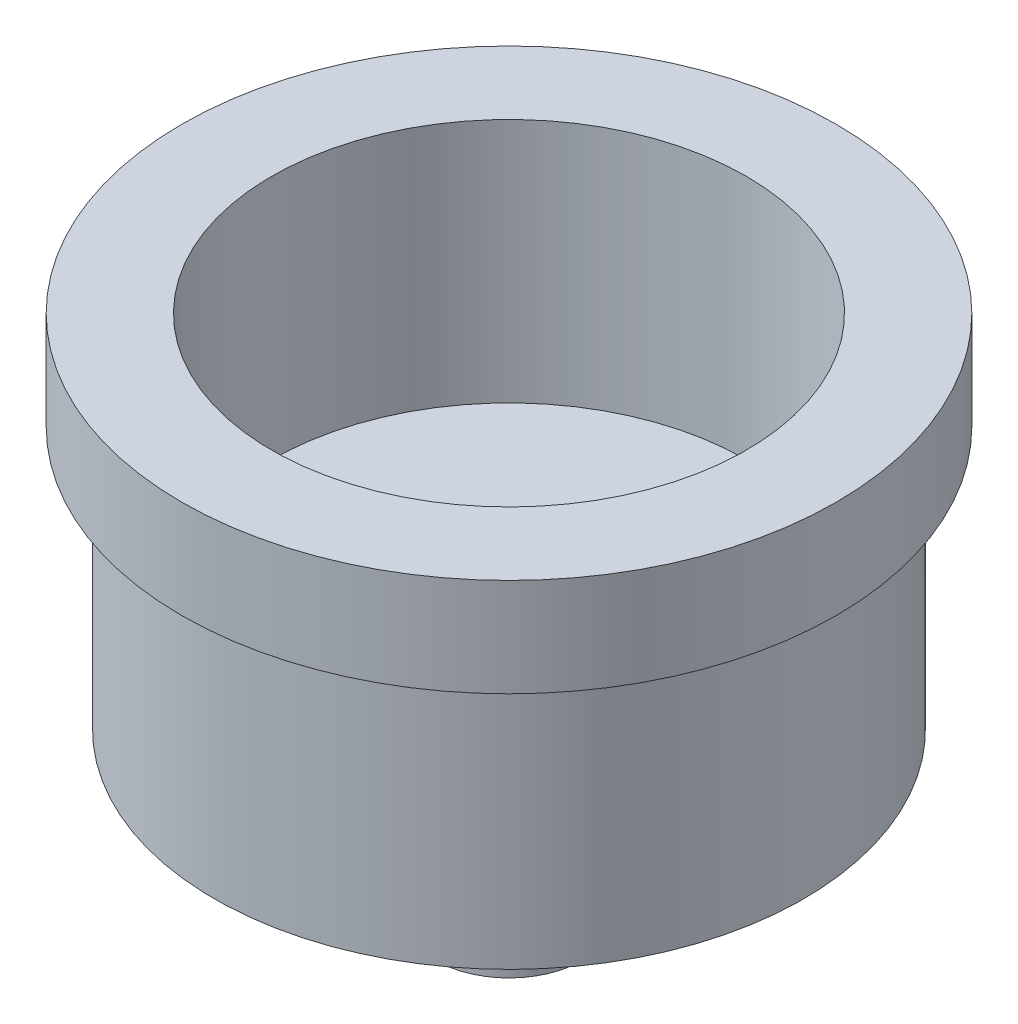
ISO-10303-21;
HEADER;
FILE_DESCRIPTION(('STEP AP214'),'2;1');
FILE_NAME('part.step','',(''),(''),'','','');
FILE_SCHEMA(('AUTOMOTIVE_DESIGN { 1 0 10303 214 1 1 1 1 }'));
ENDSEC;
DATA;
#1=APPLICATION_CONTEXT('core data for automotive mechanical design processes');
#2=APPLICATION_PROTOCOL_DEFINITION('international standard','automotive_design',2000,#1);
#3=PRODUCT_CONTEXT('',#1,'mechanical');
#4=PRODUCT('Part','Part','',(#3));
#5=PRODUCT_RELATED_PRODUCT_CATEGORY('part','',(#4));
#6=PRODUCT_DEFINITION_FORMATION('','',#4);
#7=PRODUCT_DEFINITION_CONTEXT('part definition',#1,'design');
#8=PRODUCT_DEFINITION('design','',#6,#7);
#9=PRODUCT_DEFINITION_SHAPE('','',#8);
#10=(LENGTH_UNIT() NAMED_UNIT(*) SI_UNIT(.MILLI.,.METRE.));
#11=(NAMED_UNIT(*) PLANE_ANGLE_UNIT() SI_UNIT($,.RADIAN.));
#12=(NAMED_UNIT(*) SI_UNIT($,.STERADIAN.) SOLID_ANGLE_UNIT());
#13=UNCERTAINTY_MEASURE_WITH_UNIT(LENGTH_MEASURE(1.E-05),#10,'distance_accuracy_value','');
#14=(GEOMETRIC_REPRESENTATION_CONTEXT(3) GLOBAL_UNCERTAINTY_ASSIGNED_CONTEXT((#13)) GLOBAL_UNIT_ASSIGNED_CONTEXT((#10,
#11,#12)) REPRESENTATION_CONTEXT('',''));
#15=CARTESIAN_POINT('',(0.,0.,0.));
#16=DIRECTION('',(0.,0.,1.));
#17=DIRECTION('',(1.,0.,0.));
#18=AXIS2_PLACEMENT_3D('',#15,#16,#17);
#19=CARTESIAN_POINT('',(-14.5,32.,0.));
#20=DIRECTION('',(0.,-1.,0.));
#21=DIRECTION('',(0.,0.,-1.));
#22=AXIS2_PLACEMENT_3D('',#19,#20,#21);
#23=PLANE('',#22);
#24=CARTESIAN_POINT('',(0.,32.,0.));
#25=DIRECTION('',(0.,-1.,0.));
#26=DIRECTION('',(0.,0.,-1.));
#27=AXIS2_PLACEMENT_3D('',#24,#25,#26);
#28=CIRCLE('',#27,20.);
#29=CARTESIAN_POINT('',(0.,32.,-20.));
#30=VERTEX_POINT('',#29);
#31=EDGE_CURVE('E10',#30,#30,#28,.T.);
#32=ORIENTED_EDGE('',*,*,#31,.F.);
#33=EDGE_LOOP('',(#32));
#34=FACE_BOUND('',#33,.T.);
#35=CARTESIAN_POINT('',(0.,32.,0.));
#36=DIRECTION('',(0.,-1.,0.));
#37=DIRECTION('',(0.,0.,-1.));
#38=AXIS2_PLACEMENT_3D('',#35,#36,#37);
#39=CIRCLE('',#38,14.5);
#40=CARTESIAN_POINT('',(0.,32.,-14.5));
#41=VERTEX_POINT('',#40);
#42=EDGE_CURVE('E83',#41,#41,#39,.T.);
#43=ORIENTED_EDGE('',*,*,#42,.T.);
#44=EDGE_LOOP('',(#43));
#45=FACE_BOUND('',#44,.T.);
#46=ADVANCED_FACE('F37',(#34,#45),#23,.F.);
#47=CARTESIAN_POINT('',(0.,0.,0.));
#48=DIRECTION('',(0.,-1.,0.));
#49=DIRECTION('',(0.,0.,-1.));
#50=AXIS2_PLACEMENT_3D('',#47,#48,#49);
#51=CYLINDRICAL_SURFACE('',#50,20.);
#52=CARTESIAN_POINT('',(0.,26.,0.));
#53=DIRECTION('',(0.,-1.,0.));
#54=DIRECTION('',(0.,0.,-1.));
#55=AXIS2_PLACEMENT_3D('',#52,#53,#54);
#56=CIRCLE('',#55,20.);
#57=CARTESIAN_POINT('',(0.,26.,-20.));
#58=VERTEX_POINT('',#57);
#59=EDGE_CURVE('E43',#58,#58,#56,.T.);
#60=ORIENTED_EDGE('',*,*,#59,.F.);
#61=EDGE_LOOP('',(#60));
#62=FACE_BOUND('',#61,.T.);
#63=ORIENTED_EDGE('',*,*,#31,.T.);
#64=EDGE_LOOP('',(#63));
#65=FACE_BOUND('',#64,.T.);
#66=ADVANCED_FACE('F156',(#62,#65),#51,.T.);
#67=CARTESIAN_POINT('',(-20.,26.,0.));
#68=DIRECTION('',(0.,1.,0.));
#69=DIRECTION('',(0.,0.,1.));
#70=AXIS2_PLACEMENT_3D('',#67,#68,#69);
#71=PLANE('',#70);
#72=CARTESIAN_POINT('',(0.,26.,0.));
#73=DIRECTION('',(0.,-1.,0.));
#74=DIRECTION('',(0.,0.,-1.));
#75=AXIS2_PLACEMENT_3D('',#72,#73,#74);
#76=CIRCLE('',#75,18.);
#77=CARTESIAN_POINT('',(0.,26.,-18.));
#78=VERTEX_POINT('',#77);
#79=EDGE_CURVE('E47',#78,#78,#76,.T.);
#80=ORIENTED_EDGE('',*,*,#79,.F.);
#81=EDGE_LOOP('',(#80));
#82=FACE_BOUND('',#81,.T.);
#83=ORIENTED_EDGE('',*,*,#59,.T.);
#84=EDGE_LOOP('',(#83));
#85=FACE_BOUND('',#84,.T.);
#86=ADVANCED_FACE('F151',(#82,#85),#71,.F.);
#87=CARTESIAN_POINT('',(0.,0.,0.));
#88=DIRECTION('',(0.,-1.,0.));
#89=DIRECTION('',(0.,0.,-1.));
#90=AXIS2_PLACEMENT_3D('',#87,#88,#89);
#91=CYLINDRICAL_SURFACE('',#90,18.);
#92=CARTESIAN_POINT('',(0.,9.99999999999999,0.));
#93=DIRECTION('',(0.,-1.,0.));
#94=DIRECTION('',(0.,0.,-1.));
#95=AXIS2_PLACEMENT_3D('',#92,#93,#94);
#96=CIRCLE('',#95,18.);
#97=CARTESIAN_POINT('',(0.,9.99999999999999,-18.));
#98=VERTEX_POINT('',#97);
#99=EDGE_CURVE('E51',#98,#98,#96,.T.);
#100=ORIENTED_EDGE('',*,*,#99,.F.);
#101=EDGE_LOOP('',(#100));
#102=FACE_BOUND('',#101,.T.);
#103=ORIENTED_EDGE('',*,*,#79,.T.);
#104=EDGE_LOOP('',(#103));
#105=FACE_BOUND('',#104,.T.);
#106=ADVANCED_FACE('F145',(#102,#105),#91,.T.);
#107=CARTESIAN_POINT('',(-18.,9.99999999999999,0.));
#108=DIRECTION('',(0.,1.,0.));
#109=DIRECTION('',(0.,0.,1.));
#110=AXIS2_PLACEMENT_3D('',#107,#108,#109);
#111=PLANE('',#110);
#112=CARTESIAN_POINT('',(0.,10.,0.));
#113=DIRECTION('',(0.,-1.,0.));
#114=DIRECTION('',(0.,0.,-1.));
#115=AXIS2_PLACEMENT_3D('',#112,#113,#114);
#116=CIRCLE('',#115,6.5);
#117=CARTESIAN_POINT('',(0.,10.,-6.5));
#118=VERTEX_POINT('',#117);
#119=EDGE_CURVE('E56',#118,#118,#116,.T.);
#120=ORIENTED_EDGE('',*,*,#119,.F.);
#121=EDGE_LOOP('',(#120));
#122=FACE_BOUND('',#121,.T.);
#123=ORIENTED_EDGE('',*,*,#99,.T.);
#124=EDGE_LOOP('',(#123));
#125=FACE_BOUND('',#124,.T.);
#126=ADVANCED_FACE('F139',(#122,#125),#111,.F.);
#127=CARTESIAN_POINT('',(0.,0.,0.));
#128=DIRECTION('',(0.,-1.,0.));
#129=DIRECTION('',(0.,0.,-1.));
#130=AXIS2_PLACEMENT_3D('',#127,#128,#129);
#131=CYLINDRICAL_SURFACE('',#130,6.5);
#132=CARTESIAN_POINT('',(0.,9.,0.));
#133=DIRECTION('',(0.,-1.,0.));
#134=DIRECTION('',(0.,0.,-1.));
#135=AXIS2_PLACEMENT_3D('',#132,#133,#134);
#136=CIRCLE('',#135,6.5);
#137=CARTESIAN_POINT('',(0.,9.,-6.5));
#138=VERTEX_POINT('',#137);
#139=EDGE_CURVE('E59',#138,#138,#136,.T.);
#140=ORIENTED_EDGE('',*,*,#139,.F.);
#141=EDGE_LOOP('',(#140));
#142=FACE_BOUND('',#141,.T.);
#143=ORIENTED_EDGE('',*,*,#119,.T.);
#144=EDGE_LOOP('',(#143));
#145=FACE_BOUND('',#144,.T.);
#146=ADVANCED_FACE('F133',(#142,#145),#131,.T.);
#147=CARTESIAN_POINT('',(-6.5,9.,0.));
#148=DIRECTION('',(0.,1.,0.));
#149=DIRECTION('',(0.,0.,1.));
#150=AXIS2_PLACEMENT_3D('',#147,#148,#149);
#151=PLANE('',#150);
#152=CARTESIAN_POINT('',(0.,9.,0.));
#153=DIRECTION('',(0.,-1.,0.));
#154=DIRECTION('',(0.,0.,-1.));
#155=AXIS2_PLACEMENT_3D('',#152,#153,#154);
#156=CIRCLE('',#155,4.5);
#157=CARTESIAN_POINT('',(0.,9.,-4.5));
#158=VERTEX_POINT('',#157);
#159=EDGE_CURVE('E62',#158,#158,#156,.T.);
#160=ORIENTED_EDGE('',*,*,#159,.F.);
#161=EDGE_LOOP('',(#160));
#162=FACE_BOUND('',#161,.T.);
#163=ORIENTED_EDGE('',*,*,#139,.T.);
#164=EDGE_LOOP('',(#163));
#165=FACE_BOUND('',#164,.T.);
#166=ADVANCED_FACE('F127',(#162,#165),#151,.F.);
#167=CARTESIAN_POINT('',(0.,0.,0.));
#168=DIRECTION('',(0.,-1.,0.));
#169=DIRECTION('',(0.,0.,-1.));
#170=AXIS2_PLACEMENT_3D('',#167,#168,#169);
#171=CYLINDRICAL_SURFACE('',#170,4.5);
#172=CARTESIAN_POINT('',(0.,0.,0.));
#173=DIRECTION('',(0.,-1.,0.));
#174=DIRECTION('',(0.,0.,-1.));
#175=AXIS2_PLACEMENT_3D('',#172,#173,#174);
#176=CIRCLE('',#175,4.5);
#177=CARTESIAN_POINT('',(0.,0.,-4.5));
#178=VERTEX_POINT('',#177);
#179=EDGE_CURVE('E65',#178,#178,#176,.T.);
#180=ORIENTED_EDGE('',*,*,#179,.F.);
#181=EDGE_LOOP('',(#180));
#182=FACE_BOUND('',#181,.T.);
#183=ORIENTED_EDGE('',*,*,#159,.T.);
#184=EDGE_LOOP('',(#183));
#185=FACE_BOUND('',#184,.T.);
#186=ADVANCED_FACE('F121',(#182,#185),#171,.T.);
#187=CARTESIAN_POINT('',(-4.5,0.,0.));
#188=DIRECTION('',(0.,1.,0.));
#189=DIRECTION('',(0.,0.,1.));
#190=AXIS2_PLACEMENT_3D('',#187,#188,#189);
#191=PLANE('',#190);
#192=CARTESIAN_POINT('',(0.,0.,0.));
#193=DIRECTION('',(0.,-1.,0.));
#194=DIRECTION('',(0.,0.,-1.));
#195=AXIS2_PLACEMENT_3D('',#192,#193,#194);
#196=CIRCLE('',#195,2.5);
#197=CARTESIAN_POINT('',(0.,0.,-2.5));
#198=VERTEX_POINT('',#197);
#199=EDGE_CURVE('E68',#198,#198,#196,.T.);
#200=ORIENTED_EDGE('',*,*,#199,.F.);
#201=EDGE_LOOP('',(#200));
#202=FACE_BOUND('',#201,.T.);
#203=ORIENTED_EDGE('',*,*,#179,.T.);
#204=EDGE_LOOP('',(#203));
#205=FACE_BOUND('',#204,.T.);
#206=ADVANCED_FACE('F115',(#202,#205),#191,.F.);
#207=CARTESIAN_POINT('',(0.,0.,0.));
#208=DIRECTION('',(0.,-1.,0.));
#209=DIRECTION('',(0.,0.,-1.));
#210=AXIS2_PLACEMENT_3D('',#207,#208,#209);
#211=CYLINDRICAL_SURFACE('',#210,2.5);
#212=CARTESIAN_POINT('',(0.,13.,0.));
#213=DIRECTION('',(0.,-1.,0.));
#214=DIRECTION('',(0.,0.,-1.));
#215=AXIS2_PLACEMENT_3D('',#212,#213,#214);
#216=CIRCLE('',#215,2.5);
#217=CARTESIAN_POINT('',(0.,13.,-2.5));
#218=VERTEX_POINT('',#217);
#219=EDGE_CURVE('E71',#218,#218,#216,.T.);
#220=ORIENTED_EDGE('',*,*,#219,.F.);
#221=EDGE_LOOP('',(#220));
#222=FACE_BOUND('',#221,.T.);
#223=ORIENTED_EDGE('',*,*,#199,.T.);
#224=EDGE_LOOP('',(#223));
#225=FACE_BOUND('',#224,.T.);
#226=ADVANCED_FACE('F109',(#222,#225),#211,.F.);
#227=CARTESIAN_POINT('',(-2.5,13.,0.));
#228=DIRECTION('',(0.,-1.,0.));
#229=DIRECTION('',(0.,0.,-1.));
#230=AXIS2_PLACEMENT_3D('',#227,#228,#229);
#231=PLANE('',#230);
#232=CARTESIAN_POINT('',(0.,13.,0.));
#233=DIRECTION('',(0.,-1.,0.));
#234=DIRECTION('',(0.,0.,-1.));
#235=AXIS2_PLACEMENT_3D('',#232,#233,#234);
#236=CIRCLE('',#235,4.75);
#237=CARTESIAN_POINT('',(0.,13.,-4.75));
#238=VERTEX_POINT('',#237);
#239=EDGE_CURVE('E74',#238,#238,#236,.T.);
#240=ORIENTED_EDGE('',*,*,#239,.F.);
#241=EDGE_LOOP('',(#240));
#242=FACE_BOUND('',#241,.T.);
#243=ORIENTED_EDGE('',*,*,#219,.T.);
#244=EDGE_LOOP('',(#243));
#245=FACE_BOUND('',#244,.T.);
#246=ADVANCED_FACE('F103',(#242,#245),#231,.F.);
#247=CARTESIAN_POINT('',(0.,0.,0.));
#248=DIRECTION('',(0.,-1.,0.));
#249=DIRECTION('',(0.,0.,-1.));
#250=AXIS2_PLACEMENT_3D('',#247,#248,#249);
#251=CYLINDRICAL_SURFACE('',#250,4.75);
#252=CARTESIAN_POINT('',(0.,17.,0.));
#253=DIRECTION('',(0.,-1.,0.));
#254=DIRECTION('',(0.,0.,-1.));
#255=AXIS2_PLACEMENT_3D('',#252,#253,#254);
#256=CIRCLE('',#255,4.75);
#257=CARTESIAN_POINT('',(0.,17.,-4.75));
#258=VERTEX_POINT('',#257);
#259=EDGE_CURVE('E77',#258,#258,#256,.T.);
#260=ORIENTED_EDGE('',*,*,#259,.F.);
#261=EDGE_LOOP('',(#260));
#262=FACE_BOUND('',#261,.T.);
#263=ORIENTED_EDGE('',*,*,#239,.T.);
#264=EDGE_LOOP('',(#263));
#265=FACE_BOUND('',#264,.T.);
#266=ADVANCED_FACE('F97',(#262,#265),#251,.F.);
#267=CARTESIAN_POINT('',(-4.75,17.,0.));
#268=DIRECTION('',(0.,-1.,0.));
#269=DIRECTION('',(0.,0.,-1.));
#270=AXIS2_PLACEMENT_3D('',#267,#268,#269);
#271=PLANE('',#270);
#272=CARTESIAN_POINT('',(0.,17.,0.));
#273=DIRECTION('',(0.,-1.,0.));
#274=DIRECTION('',(0.,0.,-1.));
#275=AXIS2_PLACEMENT_3D('',#272,#273,#274);
#276=CIRCLE('',#275,14.5);
#277=CARTESIAN_POINT('',(0.,17.,-14.5));
#278=VERTEX_POINT('',#277);
#279=EDGE_CURVE('E80',#278,#278,#276,.T.);
#280=ORIENTED_EDGE('',*,*,#279,.F.);
#281=EDGE_LOOP('',(#280));
#282=FACE_BOUND('',#281,.T.);
#283=ORIENTED_EDGE('',*,*,#259,.T.);
#284=EDGE_LOOP('',(#283));
#285=FACE_BOUND('',#284,.T.);
#286=ADVANCED_FACE('F91',(#282,#285),#271,.F.);
#287=CARTESIAN_POINT('',(0.,0.,0.));
#288=DIRECTION('',(0.,-1.,0.));
#289=DIRECTION('',(0.,0.,-1.));
#290=AXIS2_PLACEMENT_3D('',#287,#288,#289);
#291=CYLINDRICAL_SURFACE('',#290,14.5);
#292=ORIENTED_EDGE('',*,*,#42,.F.);
#293=EDGE_LOOP('',(#292));
#294=FACE_BOUND('',#293,.T.);
#295=ORIENTED_EDGE('',*,*,#279,.T.);
#296=EDGE_LOOP('',(#295));
#297=FACE_BOUND('',#296,.T.);
#298=ADVANCED_FACE('F88',(#294,#297),#291,.F.);
#299=CLOSED_SHELL('',(#46,#66,#86,#106,#126,#146,#166,#186,#206,#226,#246,#266,#286,#298));
#300=MANIFOLD_SOLID_BREP('B2',#299);
#301=ADVANCED_BREP_SHAPE_REPRESENTATION('',(#18,#300),#14);
#302=SHAPE_DEFINITION_REPRESENTATION(#9,#301);
ENDSEC;
END-ISO-10303-21;
